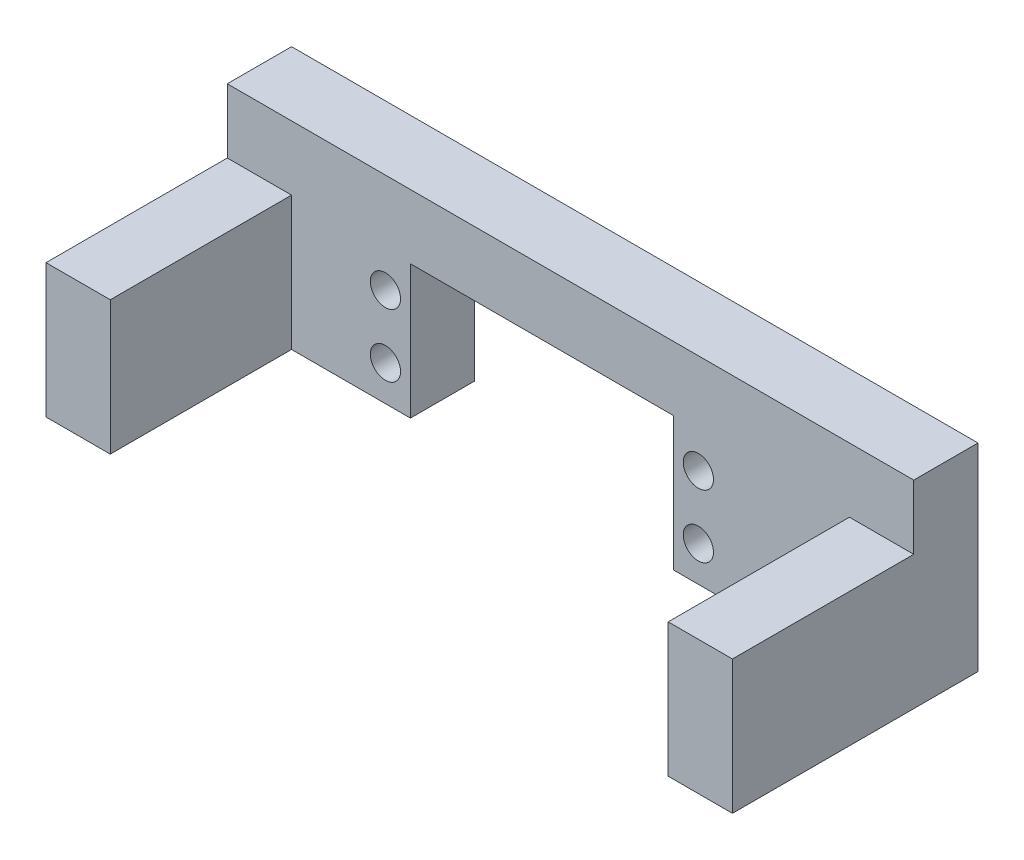
ISO-10303-21;
HEADER;
FILE_DESCRIPTION(('STEP AP214'),'2;1');
FILE_NAME('part.step','',(''),(''),'','','');
FILE_SCHEMA(('AUTOMOTIVE_DESIGN { 1 0 10303 214 1 1 1 1 }'));
ENDSEC;
DATA;
#1=APPLICATION_CONTEXT('core data for automotive mechanical design processes');
#2=APPLICATION_PROTOCOL_DEFINITION('international standard','automotive_design',2000,#1);
#3=PRODUCT_CONTEXT('',#1,'mechanical');
#4=PRODUCT('Part','Part','',(#3));
#5=PRODUCT_RELATED_PRODUCT_CATEGORY('part','',(#4));
#6=PRODUCT_DEFINITION_FORMATION('','',#4);
#7=PRODUCT_DEFINITION_CONTEXT('part definition',#1,'design');
#8=PRODUCT_DEFINITION('design','',#6,#7);
#9=PRODUCT_DEFINITION_SHAPE('','',#8);
#10=(LENGTH_UNIT() NAMED_UNIT(*) SI_UNIT(.MILLI.,.METRE.));
#11=(NAMED_UNIT(*) PLANE_ANGLE_UNIT() SI_UNIT($,.RADIAN.));
#12=(NAMED_UNIT(*) SI_UNIT($,.STERADIAN.) SOLID_ANGLE_UNIT());
#13=UNCERTAINTY_MEASURE_WITH_UNIT(LENGTH_MEASURE(1.E-05),#10,'distance_accuracy_value','');
#14=(GEOMETRIC_REPRESENTATION_CONTEXT(3) GLOBAL_UNCERTAINTY_ASSIGNED_CONTEXT((#13)) GLOBAL_UNIT_ASSIGNED_CONTEXT((#10,
#11,#12)) REPRESENTATION_CONTEXT('',''));
#15=CARTESIAN_POINT('',(0.,0.,0.));
#16=DIRECTION('',(0.,0.,1.));
#17=DIRECTION('',(1.,0.,0.));
#18=AXIS2_PLACEMENT_3D('',#15,#16,#17);
#19=CARTESIAN_POINT('',(0.,10.4,0.));
#20=DIRECTION('',(0.,1.,0.));
#21=DIRECTION('',(-1.,0.,0.));
#22=AXIS2_PLACEMENT_3D('',#19,#20,#21);
#23=PLANE('',#22);
#24=DIRECTION('',(0.,0.,-1.));
#25=VECTOR('',#24,1.);
#26=CARTESIAN_POINT('',(11.,10.4,10.));
#27=LINE('',#26,#25);
#28=CARTESIAN_POINT('',(11.,10.4,10.));
#29=VERTEX_POINT('',#28);
#30=CARTESIAN_POINT('',(11.,10.4,0.));
#31=VERTEX_POINT('',#30);
#32=EDGE_CURVE('E189',#29,#31,#27,.T.);
#33=ORIENTED_EDGE('',*,*,#32,.F.);
#34=DIRECTION('',(1.,0.,0.));
#35=VECTOR('',#34,1.);
#36=CARTESIAN_POINT('',(-58.395,10.4,10.));
#37=LINE('',#36,#35);
#38=CARTESIAN_POINT('',(-29.9,10.4,10.));
#39=VERTEX_POINT('',#38);
#40=EDGE_CURVE('E251',#39,#29,#37,.T.);
#41=ORIENTED_EDGE('',*,*,#40,.F.);
#42=DIRECTION('',(0.,0.,-1.));
#43=VECTOR('',#42,1.);
#44=CARTESIAN_POINT('',(-29.9,10.4,10.));
#45=LINE('',#44,#43);
#46=CARTESIAN_POINT('',(-29.9,10.4,0.));
#47=VERTEX_POINT('',#46);
#48=EDGE_CURVE('E313',#39,#47,#45,.T.);
#49=ORIENTED_EDGE('',*,*,#48,.T.);
#50=DIRECTION('',(-1.,0.,0.));
#51=VECTOR('',#50,1.);
#52=CARTESIAN_POINT('',(-58.395,10.4,0.));
#53=LINE('',#52,#51);
#54=EDGE_CURVE('E257',#31,#47,#53,.T.);
#55=ORIENTED_EDGE('',*,*,#54,.F.);
#56=EDGE_LOOP('',(#33,#41,#49,#55));
#57=FACE_BOUND('',#56,.T.);
#58=ADVANCED_FACE('F63',(#57),#23,.F.);
#59=CARTESIAN_POINT('',(-48.395,10.4,10.));
#60=DIRECTION('',(0.,1.,0.));
#61=DIRECTION('',(-1.,0.,0.));
#62=AXIS2_PLACEMENT_3D('',#59,#60,#61);
#63=PLANE('',#62);
#64=CARTESIAN_POINT('',(-58.395,10.4,10.));
#65=VERTEX_POINT('',#64);
#66=CARTESIAN_POINT('',(-48.395,10.4,10.));
#67=VERTEX_POINT('',#66);
#68=EDGE_CURVE('E268',#65,#67,#37,.T.);
#69=ORIENTED_EDGE('',*,*,#68,.F.);
#70=DIRECTION('',(0.,0.,-1.));
#71=VECTOR('',#70,1.);
#72=CARTESIAN_POINT('',(-58.395,10.4,10.));
#73=LINE('',#72,#71);
#74=CARTESIAN_POINT('',(-58.395,10.4,38.2));
#75=VERTEX_POINT('',#74);
#76=EDGE_CURVE('E107',#75,#65,#73,.T.);
#77=ORIENTED_EDGE('',*,*,#76,.F.);
#78=DIRECTION('',(-1.,0.,0.));
#79=VECTOR('',#78,1.);
#80=CARTESIAN_POINT('',(-58.395,10.4,38.2));
#81=LINE('',#80,#79);
#82=CARTESIAN_POINT('',(-48.395,10.4,38.2));
#83=VERTEX_POINT('',#82);
#84=EDGE_CURVE('E290',#83,#75,#81,.T.);
#85=ORIENTED_EDGE('',*,*,#84,.F.);
#86=DIRECTION('',(0.,0.,-1.));
#87=VECTOR('',#86,1.);
#88=CARTESIAN_POINT('',(-48.395,10.4,38.2));
#89=LINE('',#88,#87);
#90=EDGE_CURVE('E293',#83,#67,#89,.T.);
#91=ORIENTED_EDGE('',*,*,#90,.T.);
#92=EDGE_LOOP('',(#69,#77,#85,#91));
#93=FACE_BOUND('',#92,.T.);
#94=ADVANCED_FACE('F358',(#93),#63,.T.);
#95=CARTESIAN_POINT('',(-48.395,-10.4,10.));
#96=DIRECTION('',(0.,1.,0.));
#97=DIRECTION('',(0.,0.,1.));
#98=AXIS2_PLACEMENT_3D('',#95,#96,#97);
#99=PLANE('',#98);
#100=DIRECTION('',(-1.,0.,0.));
#101=VECTOR('',#100,1.);
#102=CARTESIAN_POINT('',(-48.395,-10.4,0.));
#103=LINE('',#102,#101);
#104=CARTESIAN_POINT('',(-29.9,-10.4,0.));
#105=VERTEX_POINT('',#104);
#106=CARTESIAN_POINT('',(-58.395,-10.4,0.));
#107=VERTEX_POINT('',#106);
#108=EDGE_CURVE('E12',#105,#107,#103,.T.);
#109=ORIENTED_EDGE('',*,*,#108,.F.);
#110=DIRECTION('',(0.,0.,-1.));
#111=VECTOR('',#110,1.);
#112=CARTESIAN_POINT('',(-29.9,-10.4,10.));
#113=LINE('',#112,#111);
#114=CARTESIAN_POINT('',(-29.9,-10.4,10.));
#115=VERTEX_POINT('',#114);
#116=EDGE_CURVE('E303',#115,#105,#113,.T.);
#117=ORIENTED_EDGE('',*,*,#116,.F.);
#118=DIRECTION('',(-1.,0.,0.));
#119=VECTOR('',#118,1.);
#120=CARTESIAN_POINT('',(-48.395,-10.4,10.));
#121=LINE('',#120,#119);
#122=CARTESIAN_POINT('',(-48.395,-10.4,10.));
#123=VERTEX_POINT('',#122);
#124=EDGE_CURVE('E99',#115,#123,#121,.T.);
#125=ORIENTED_EDGE('',*,*,#124,.T.);
#126=DIRECTION('',(0.,0.,-1.));
#127=VECTOR('',#126,1.);
#128=CARTESIAN_POINT('',(-48.395,-10.4,38.2));
#129=LINE('',#128,#127);
#130=CARTESIAN_POINT('',(-48.395,-10.4,38.2));
#131=VERTEX_POINT('',#130);
#132=EDGE_CURVE('E299',#131,#123,#129,.T.);
#133=ORIENTED_EDGE('',*,*,#132,.F.);
#134=DIRECTION('',(1.,0.,0.));
#135=VECTOR('',#134,1.);
#136=CARTESIAN_POINT('',(-58.395,-10.4,38.2));
#137=LINE('',#136,#135);
#138=CARTESIAN_POINT('',(-58.395,-10.4,38.2));
#139=VERTEX_POINT('',#138);
#140=EDGE_CURVE('E284',#139,#131,#137,.T.);
#141=ORIENTED_EDGE('',*,*,#140,.F.);
#142=DIRECTION('',(0.,0.,-1.));
#143=VECTOR('',#142,1.);
#144=CARTESIAN_POINT('',(-58.395,-10.4,10.));
#145=LINE('',#144,#143);
#146=EDGE_CURVE('E90',#139,#107,#145,.T.);
#147=ORIENTED_EDGE('',*,*,#146,.T.);
#148=EDGE_LOOP('',(#109,#117,#125,#133,#141,#147));
#149=FACE_BOUND('',#148,.T.);
#150=ADVANCED_FACE('F364',(#149),#99,.F.);
#151=CARTESIAN_POINT('',(-29.9,-10.4,10.));
#152=DIRECTION('',(-1.,0.,0.));
#153=DIRECTION('',(0.,0.,1.));
#154=AXIS2_PLACEMENT_3D('',#151,#152,#153);
#155=PLANE('',#154);
#156=DIRECTION('',(0.,1.,0.));
#157=VECTOR('',#156,1.);
#158=CARTESIAN_POINT('',(-29.9,-10.4,0.));
#159=LINE('',#158,#157);
#160=EDGE_CURVE('E308',#105,#47,#159,.T.);
#161=ORIENTED_EDGE('',*,*,#160,.T.);
#162=ORIENTED_EDGE('',*,*,#48,.F.);
#163=DIRECTION('',(0.,1.,0.));
#164=VECTOR('',#163,1.);
#165=CARTESIAN_POINT('',(-29.9,-10.4,10.));
#166=LINE('',#165,#164);
#167=EDGE_CURVE('E67',#115,#39,#166,.T.);
#168=ORIENTED_EDGE('',*,*,#167,.F.);
#169=ORIENTED_EDGE('',*,*,#116,.T.);
#170=EDGE_LOOP('',(#161,#162,#168,#169));
#171=FACE_BOUND('',#170,.T.);
#172=ADVANCED_FACE('F327',(#171),#155,.F.);
#173=CARTESIAN_POINT('',(0.,0.,10.));
#174=DIRECTION('',(0.,0.,1.));
#175=DIRECTION('',(1.,0.,0.));
#176=AXIS2_PLACEMENT_3D('',#173,#174,#175);
#177=PLANE('',#176);
#178=CARTESIAN_POINT('',(14.89,4.9,10.));
#179=DIRECTION('',(0.,0.,1.));
#180=DIRECTION('',(-1.,0.,0.));
#181=AXIS2_PLACEMENT_3D('',#178,#179,#180);
#182=CIRCLE('',#181,2.35);
#183=CARTESIAN_POINT('',(12.54,4.9,10.));
#184=VERTEX_POINT('',#183);
#185=EDGE_CURVE('E496',#184,#184,#182,.T.);
#186=ORIENTED_EDGE('',*,*,#185,.F.);
#187=EDGE_LOOP('',(#186));
#188=FACE_BOUND('',#187,.T.);
#189=CARTESIAN_POINT('',(-33.79,-4.9,10.));
#190=DIRECTION('',(0.,0.,1.));
#191=DIRECTION('',(-1.,0.,0.));
#192=AXIS2_PLACEMENT_3D('',#189,#190,#191);
#193=CIRCLE('',#192,2.35);
#194=CARTESIAN_POINT('',(-36.14,-4.9,10.));
#195=VERTEX_POINT('',#194);
#196=EDGE_CURVE('E504',#195,#195,#193,.T.);
#197=ORIENTED_EDGE('',*,*,#196,.F.);
#198=EDGE_LOOP('',(#197));
#199=FACE_BOUND('',#198,.T.);
#200=CARTESIAN_POINT('',(-33.79,4.9,10.));
#201=DIRECTION('',(0.,0.,1.));
#202=DIRECTION('',(1.,0.,0.));
#203=AXIS2_PLACEMENT_3D('',#200,#201,#202);
#204=CIRCLE('',#203,2.35);
#205=CARTESIAN_POINT('',(-31.44,4.9,10.));
#206=VERTEX_POINT('',#205);
#207=EDGE_CURVE('E524',#206,#206,#204,.T.);
#208=ORIENTED_EDGE('',*,*,#207,.F.);
#209=EDGE_LOOP('',(#208));
#210=FACE_BOUND('',#209,.T.);
#211=CARTESIAN_POINT('',(14.89,-4.9,10.));
#212=DIRECTION('',(0.,0.,1.));
#213=DIRECTION('',(1.,0.,0.));
#214=AXIS2_PLACEMENT_3D('',#211,#212,#213);
#215=CIRCLE('',#214,2.35);
#216=CARTESIAN_POINT('',(17.24,-4.9,10.));
#217=VERTEX_POINT('',#216);
#218=EDGE_CURVE('E213',#217,#217,#215,.T.);
#219=ORIENTED_EDGE('',*,*,#218,.F.);
#220=EDGE_LOOP('',(#219));
#221=FACE_BOUND('',#220,.T.);
#222=DIRECTION('',(0.,1.,0.));
#223=VECTOR('',#222,1.);
#224=CARTESIAN_POINT('',(-48.395,10.4,10.));
#225=LINE('',#224,#223);
#226=EDGE_CURVE('E81',#123,#67,#225,.T.);
#227=ORIENTED_EDGE('',*,*,#226,.F.);
#228=ORIENTED_EDGE('',*,*,#124,.F.);
#229=ORIENTED_EDGE('',*,*,#167,.T.);
#230=ORIENTED_EDGE('',*,*,#40,.T.);
#231=DIRECTION('',(0.,-1.,0.));
#232=VECTOR('',#231,1.);
#233=CARTESIAN_POINT('',(11.,10.4,10.));
#234=LINE('',#233,#232);
#235=CARTESIAN_POINT('',(11.,-10.4,10.));
#236=VERTEX_POINT('',#235);
#237=EDGE_CURVE('E230',#29,#236,#234,.T.);
#238=ORIENTED_EDGE('',*,*,#237,.T.);
#239=DIRECTION('',(-1.,0.,0.));
#240=VECTOR('',#239,1.);
#241=CARTESIAN_POINT('',(48.395,-10.4,10.));
#242=LINE('',#241,#240);
#243=CARTESIAN_POINT('',(38.395,-10.4,10.));
#244=VERTEX_POINT('',#243);
#245=EDGE_CURVE('E227',#244,#236,#242,.T.);
#246=ORIENTED_EDGE('',*,*,#245,.F.);
#247=DIRECTION('',(0.,-1.,0.));
#248=VECTOR('',#247,1.);
#249=CARTESIAN_POINT('',(38.395,10.4,10.));
#250=LINE('',#249,#248);
#251=CARTESIAN_POINT('',(38.395,10.4,10.));
#252=VERTEX_POINT('',#251);
#253=EDGE_CURVE('E206',#252,#244,#250,.T.);
#254=ORIENTED_EDGE('',*,*,#253,.F.);
#255=DIRECTION('',(1.,0.,0.));
#256=VECTOR('',#255,1.);
#257=CARTESIAN_POINT('',(0.,10.4,10.));
#258=LINE('',#257,#256);
#259=CARTESIAN_POINT('',(48.395,10.4,10.));
#260=VERTEX_POINT('',#259);
#261=EDGE_CURVE('E243',#252,#260,#258,.T.);
#262=ORIENTED_EDGE('',*,*,#261,.T.);
#263=DIRECTION('',(0.,-1.,0.));
#264=VECTOR('',#263,1.);
#265=CARTESIAN_POINT('',(48.395,20.4,10.));
#266=LINE('',#265,#264);
#267=CARTESIAN_POINT('',(48.395,20.4,10.));
#268=VERTEX_POINT('',#267);
#269=EDGE_CURVE('E184',#268,#260,#266,.T.);
#270=ORIENTED_EDGE('',*,*,#269,.F.);
#271=DIRECTION('',(1.,0.,0.));
#272=VECTOR('',#271,1.);
#273=CARTESIAN_POINT('',(-58.395,20.4,10.));
#274=LINE('',#273,#272);
#275=CARTESIAN_POINT('',(-58.395,20.4,10.));
#276=VERTEX_POINT('',#275);
#277=EDGE_CURVE('E256',#276,#268,#274,.T.);
#278=ORIENTED_EDGE('',*,*,#277,.F.);
#279=DIRECTION('',(0.,-1.,0.));
#280=VECTOR('',#279,1.);
#281=CARTESIAN_POINT('',(-58.395,20.4,10.));
#282=LINE('',#281,#280);
#283=EDGE_CURVE('E277',#276,#65,#282,.T.);
#284=ORIENTED_EDGE('',*,*,#283,.T.);
#285=ORIENTED_EDGE('',*,*,#68,.T.);
#286=EDGE_LOOP('',(#227,#228,#229,#230,#238,#246,#254,#262,#270,#278,#284,#285));
#287=FACE_BOUND('',#286,.T.);
#288=ADVANCED_FACE('F65',(#188,#199,#210,#221,#287),#177,.T.);
#289=CARTESIAN_POINT('',(0.,0.,0.));
#290=DIRECTION('',(0.,0.,1.));
#291=DIRECTION('',(1.,0.,0.));
#292=AXIS2_PLACEMENT_3D('',#289,#290,#291);
#293=PLANE('',#292);
#294=CARTESIAN_POINT('',(14.89,4.9,0.));
#295=DIRECTION('',(0.,0.,1.));
#296=DIRECTION('',(-1.,0.,0.));
#297=AXIS2_PLACEMENT_3D('',#294,#295,#296);
#298=CIRCLE('',#297,2.35);
#299=CARTESIAN_POINT('',(12.54,4.9,0.));
#300=VERTEX_POINT('',#299);
#301=EDGE_CURVE('E493',#300,#300,#298,.T.);
#302=ORIENTED_EDGE('',*,*,#301,.T.);
#303=EDGE_LOOP('',(#302));
#304=FACE_BOUND('',#303,.T.);
#305=CARTESIAN_POINT('',(-33.79,-4.9,0.));
#306=DIRECTION('',(0.,0.,1.));
#307=DIRECTION('',(-1.,0.,0.));
#308=AXIS2_PLACEMENT_3D('',#305,#306,#307);
#309=CIRCLE('',#308,2.35);
#310=CARTESIAN_POINT('',(-36.14,-4.9,0.));
#311=VERTEX_POINT('',#310);
#312=EDGE_CURVE('E498',#311,#311,#309,.T.);
#313=ORIENTED_EDGE('',*,*,#312,.T.);
#314=EDGE_LOOP('',(#313));
#315=FACE_BOUND('',#314,.T.);
#316=CARTESIAN_POINT('',(-33.79,4.9,0.));
#317=DIRECTION('',(0.,0.,1.));
#318=DIRECTION('',(1.,0.,0.));
#319=AXIS2_PLACEMENT_3D('',#316,#317,#318);
#320=CIRCLE('',#319,2.35);
#321=CARTESIAN_POINT('',(-31.44,4.9,0.));
#322=VERTEX_POINT('',#321);
#323=EDGE_CURVE('E510',#322,#322,#320,.T.);
#324=ORIENTED_EDGE('',*,*,#323,.T.);
#325=EDGE_LOOP('',(#324));
#326=FACE_BOUND('',#325,.T.);
#327=CARTESIAN_POINT('',(14.89,-4.9,0.));
#328=DIRECTION('',(0.,0.,1.));
#329=DIRECTION('',(1.,0.,0.));
#330=AXIS2_PLACEMENT_3D('',#327,#328,#329);
#331=CIRCLE('',#330,2.35);
#332=CARTESIAN_POINT('',(17.24,-4.9,0.));
#333=VERTEX_POINT('',#332);
#334=EDGE_CURVE('E210',#333,#333,#331,.T.);
#335=ORIENTED_EDGE('',*,*,#334,.T.);
#336=EDGE_LOOP('',(#335));
#337=FACE_BOUND('',#336,.T.);
#338=DIRECTION('',(0.,-1.,0.));
#339=VECTOR('',#338,1.);
#340=CARTESIAN_POINT('',(-58.395,10.4,0.));
#341=LINE('',#340,#339);
#342=CARTESIAN_POINT('',(-58.395,20.4,0.));
#343=VERTEX_POINT('',#342);
#344=EDGE_CURVE('E73',#343,#107,#341,.T.);
#345=ORIENTED_EDGE('',*,*,#344,.F.);
#346=DIRECTION('',(-1.,0.,0.));
#347=VECTOR('',#346,1.);
#348=CARTESIAN_POINT('',(-58.395,20.4,0.));
#349=LINE('',#348,#347);
#350=CARTESIAN_POINT('',(48.395,20.4,0.));
#351=VERTEX_POINT('',#350);
#352=EDGE_CURVE('E263',#351,#343,#349,.T.);
#353=ORIENTED_EDGE('',*,*,#352,.F.);
#354=DIRECTION('',(0.,-1.,0.));
#355=VECTOR('',#354,1.);
#356=CARTESIAN_POINT('',(48.395,20.4,0.));
#357=LINE('',#356,#355);
#358=CARTESIAN_POINT('',(48.395,-10.4,0.));
#359=VERTEX_POINT('',#358);
#360=EDGE_CURVE('E267',#351,#359,#357,.T.);
#361=ORIENTED_EDGE('',*,*,#360,.T.);
#362=DIRECTION('',(-1.,0.,0.));
#363=VECTOR('',#362,1.);
#364=CARTESIAN_POINT('',(48.395,-10.4,0.));
#365=LINE('',#364,#363);
#366=CARTESIAN_POINT('',(11.,-10.4,0.));
#367=VERTEX_POINT('',#366);
#368=EDGE_CURVE('E226',#359,#367,#365,.T.);
#369=ORIENTED_EDGE('',*,*,#368,.T.);
#370=DIRECTION('',(0.,-1.,0.));
#371=VECTOR('',#370,1.);
#372=CARTESIAN_POINT('',(11.,10.4,0.));
#373=LINE('',#372,#371);
#374=EDGE_CURVE('E231',#31,#367,#373,.T.);
#375=ORIENTED_EDGE('',*,*,#374,.F.);
#376=ORIENTED_EDGE('',*,*,#54,.T.);
#377=ORIENTED_EDGE('',*,*,#160,.F.);
#378=ORIENTED_EDGE('',*,*,#108,.T.);
#379=EDGE_LOOP('',(#345,#353,#361,#369,#375,#376,#377,#378));
#380=FACE_BOUND('',#379,.T.);
#381=ADVANCED_FACE('F337',(#304,#315,#326,#337,#380),#293,.F.);
#382=CARTESIAN_POINT('',(-58.395,10.4,10.));
#383=DIRECTION('',(1.,0.,0.));
#384=DIRECTION('',(0.,0.,-1.));
#385=AXIS2_PLACEMENT_3D('',#382,#383,#384);
#386=PLANE('',#385);
#387=ORIENTED_EDGE('',*,*,#344,.T.);
#388=ORIENTED_EDGE('',*,*,#146,.F.);
#389=DIRECTION('',(0.,-1.,0.));
#390=VECTOR('',#389,1.);
#391=CARTESIAN_POINT('',(-58.395,10.4,38.2));
#392=LINE('',#391,#390);
#393=EDGE_CURVE('E280',#75,#139,#392,.T.);
#394=ORIENTED_EDGE('',*,*,#393,.F.);
#395=ORIENTED_EDGE('',*,*,#76,.T.);
#396=ORIENTED_EDGE('',*,*,#283,.F.);
#397=DIRECTION('',(0.,0.,1.));
#398=VECTOR('',#397,1.);
#399=CARTESIAN_POINT('',(-58.395,20.4,0.));
#400=LINE('',#399,#398);
#401=EDGE_CURVE('E252',#343,#276,#400,.T.);
#402=ORIENTED_EDGE('',*,*,#401,.F.);
#403=EDGE_LOOP('',(#387,#388,#394,#395,#396,#402));
#404=FACE_BOUND('',#403,.T.);
#405=ADVANCED_FACE('F360',(#404),#386,.F.);
#406=CARTESIAN_POINT('',(-48.395,10.4,38.2));
#407=DIRECTION('',(-1.,0.,0.));
#408=DIRECTION('',(0.,0.,1.));
#409=AXIS2_PLACEMENT_3D('',#406,#407,#408);
#410=PLANE('',#409);
#411=ORIENTED_EDGE('',*,*,#226,.T.);
#412=ORIENTED_EDGE('',*,*,#90,.F.);
#413=DIRECTION('',(0.,1.,0.));
#414=VECTOR('',#413,1.);
#415=CARTESIAN_POINT('',(-48.395,10.4,38.2));
#416=LINE('',#415,#414);
#417=EDGE_CURVE('E287',#131,#83,#416,.T.);
#418=ORIENTED_EDGE('',*,*,#417,.F.);
#419=ORIENTED_EDGE('',*,*,#132,.T.);
#420=EDGE_LOOP('',(#411,#412,#418,#419));
#421=FACE_BOUND('',#420,.T.);
#422=ADVANCED_FACE('F369',(#421),#410,.F.);
#423=CARTESIAN_POINT('',(0.,0.,38.2));
#424=DIRECTION('',(0.,0.,1.));
#425=DIRECTION('',(1.,0.,0.));
#426=AXIS2_PLACEMENT_3D('',#423,#424,#425);
#427=PLANE('',#426);
#428=ORIENTED_EDGE('',*,*,#393,.T.);
#429=ORIENTED_EDGE('',*,*,#140,.T.);
#430=ORIENTED_EDGE('',*,*,#417,.T.);
#431=ORIENTED_EDGE('',*,*,#84,.T.);
#432=EDGE_LOOP('',(#428,#429,#430,#431));
#433=FACE_BOUND('',#432,.T.);
#434=ADVANCED_FACE('F376',(#433),#427,.T.);
#435=CARTESIAN_POINT('',(48.395,20.4,0.));
#436=DIRECTION('',(-1.,0.,0.));
#437=DIRECTION('',(0.,-1.,0.));
#438=AXIS2_PLACEMENT_3D('',#435,#436,#437);
#439=PLANE('',#438);
#440=ORIENTED_EDGE('',*,*,#269,.T.);
#441=DIRECTION('',(0.,0.,-1.));
#442=VECTOR('',#441,1.);
#443=CARTESIAN_POINT('',(48.395,10.4,10.));
#444=LINE('',#443,#442);
#445=CARTESIAN_POINT('',(48.395,10.4,38.2));
#446=VERTEX_POINT('',#445);
#447=EDGE_CURVE('E176',#446,#260,#444,.T.);
#448=ORIENTED_EDGE('',*,*,#447,.F.);
#449=DIRECTION('',(0.,1.,0.));
#450=VECTOR('',#449,1.);
#451=CARTESIAN_POINT('',(48.395,10.4,38.2));
#452=LINE('',#451,#450);
#453=CARTESIAN_POINT('',(48.395,-10.4,38.2));
#454=VERTEX_POINT('',#453);
#455=EDGE_CURVE('E181',#454,#446,#452,.T.);
#456=ORIENTED_EDGE('',*,*,#455,.F.);
#457=DIRECTION('',(0.,0.,-1.));
#458=VECTOR('',#457,1.);
#459=CARTESIAN_POINT('',(48.395,-10.4,10.));
#460=LINE('',#459,#458);
#461=EDGE_CURVE('E188',#454,#359,#460,.T.);
#462=ORIENTED_EDGE('',*,*,#461,.T.);
#463=ORIENTED_EDGE('',*,*,#360,.F.);
#464=DIRECTION('',(0.,0.,-1.));
#465=VECTOR('',#464,1.);
#466=CARTESIAN_POINT('',(48.395,20.4,0.));
#467=LINE('',#466,#465);
#468=EDGE_CURVE('E260',#268,#351,#467,.T.);
#469=ORIENTED_EDGE('',*,*,#468,.F.);
#470=EDGE_LOOP('',(#440,#448,#456,#462,#463,#469));
#471=FACE_BOUND('',#470,.T.);
#472=ADVANCED_FACE('F178',(#471),#439,.F.);
#473=CARTESIAN_POINT('',(0.,20.4,0.));
#474=DIRECTION('',(0.,1.,0.));
#475=DIRECTION('',(-1.,0.,0.));
#476=AXIS2_PLACEMENT_3D('',#473,#474,#475);
#477=PLANE('',#476);
#478=ORIENTED_EDGE('',*,*,#401,.T.);
#479=ORIENTED_EDGE('',*,*,#277,.T.);
#480=ORIENTED_EDGE('',*,*,#468,.T.);
#481=ORIENTED_EDGE('',*,*,#352,.T.);
#482=EDGE_LOOP('',(#478,#479,#480,#481));
#483=FACE_BOUND('',#482,.T.);
#484=ADVANCED_FACE('F389',(#483),#477,.T.);
#485=CARTESIAN_POINT('',(48.395,-10.4,10.));
#486=DIRECTION('',(0.,-1.,0.));
#487=DIRECTION('',(1.,0.,0.));
#488=AXIS2_PLACEMENT_3D('',#485,#486,#487);
#489=PLANE('',#488);
#490=ORIENTED_EDGE('',*,*,#368,.F.);
#491=ORIENTED_EDGE('',*,*,#461,.F.);
#492=DIRECTION('',(1.,0.,0.));
#493=VECTOR('',#492,1.);
#494=CARTESIAN_POINT('',(48.395,-10.4,38.2));
#495=LINE('',#494,#493);
#496=CARTESIAN_POINT('',(38.395,-10.4,38.2));
#497=VERTEX_POINT('',#496);
#498=EDGE_CURVE('E204',#497,#454,#495,.T.);
#499=ORIENTED_EDGE('',*,*,#498,.F.);
#500=DIRECTION('',(0.,0.,-1.));
#501=VECTOR('',#500,1.);
#502=CARTESIAN_POINT('',(38.395,-10.4,38.2));
#503=LINE('',#502,#501);
#504=EDGE_CURVE('E219',#497,#244,#503,.T.);
#505=ORIENTED_EDGE('',*,*,#504,.T.);
#506=ORIENTED_EDGE('',*,*,#245,.T.);
#507=DIRECTION('',(0.,0.,-1.));
#508=VECTOR('',#507,1.);
#509=CARTESIAN_POINT('',(11.,-10.4,10.));
#510=LINE('',#509,#508);
#511=EDGE_CURVE('E235',#236,#367,#510,.T.);
#512=ORIENTED_EDGE('',*,*,#511,.T.);
#513=EDGE_LOOP('',(#490,#491,#499,#505,#506,#512));
#514=FACE_BOUND('',#513,.T.);
#515=ADVANCED_FACE('F342',(#514),#489,.T.);
#516=CARTESIAN_POINT('',(48.395,10.4,10.));
#517=DIRECTION('',(0.,-1.,0.));
#518=DIRECTION('',(1.,0.,0.));
#519=AXIS2_PLACEMENT_3D('',#516,#517,#518);
#520=PLANE('',#519);
#521=ORIENTED_EDGE('',*,*,#261,.F.);
#522=DIRECTION('',(0.,0.,-1.));
#523=VECTOR('',#522,1.);
#524=CARTESIAN_POINT('',(38.395,10.4,38.2));
#525=LINE('',#524,#523);
#526=CARTESIAN_POINT('',(38.395,10.4,38.2));
#527=VERTEX_POINT('',#526);
#528=EDGE_CURVE('E195',#527,#252,#525,.T.);
#529=ORIENTED_EDGE('',*,*,#528,.F.);
#530=DIRECTION('',(-1.,0.,0.));
#531=VECTOR('',#530,1.);
#532=CARTESIAN_POINT('',(48.395,10.4,38.2));
#533=LINE('',#532,#531);
#534=EDGE_CURVE('E192',#446,#527,#533,.T.);
#535=ORIENTED_EDGE('',*,*,#534,.F.);
#536=ORIENTED_EDGE('',*,*,#447,.T.);
#537=EDGE_LOOP('',(#521,#529,#535,#536));
#538=FACE_BOUND('',#537,.T.);
#539=ADVANCED_FACE('F193',(#538),#520,.F.);
#540=CARTESIAN_POINT('',(11.,10.4,10.));
#541=DIRECTION('',(1.,0.,0.));
#542=DIRECTION('',(0.,0.,-1.));
#543=AXIS2_PLACEMENT_3D('',#540,#541,#542);
#544=PLANE('',#543);
#545=ORIENTED_EDGE('',*,*,#374,.T.);
#546=ORIENTED_EDGE('',*,*,#511,.F.);
#547=ORIENTED_EDGE('',*,*,#237,.F.);
#548=ORIENTED_EDGE('',*,*,#32,.T.);
#549=EDGE_LOOP('',(#545,#546,#547,#548));
#550=FACE_BOUND('',#549,.T.);
#551=ADVANCED_FACE('F334',(#550),#544,.F.);
#552=CARTESIAN_POINT('',(38.395,10.4,38.2));
#553=DIRECTION('',(1.,0.,0.));
#554=DIRECTION('',(0.,1.,0.));
#555=AXIS2_PLACEMENT_3D('',#552,#553,#554);
#556=PLANE('',#555);
#557=ORIENTED_EDGE('',*,*,#253,.T.);
#558=ORIENTED_EDGE('',*,*,#504,.F.);
#559=DIRECTION('',(0.,-1.,0.));
#560=VECTOR('',#559,1.);
#561=CARTESIAN_POINT('',(38.395,10.4,38.2));
#562=LINE('',#561,#560);
#563=EDGE_CURVE('E199',#527,#497,#562,.T.);
#564=ORIENTED_EDGE('',*,*,#563,.F.);
#565=ORIENTED_EDGE('',*,*,#528,.T.);
#566=EDGE_LOOP('',(#557,#558,#564,#565));
#567=FACE_BOUND('',#566,.T.);
#568=ADVANCED_FACE('F346',(#567),#556,.F.);
#569=CARTESIAN_POINT('',(0.,0.,38.2));
#570=DIRECTION('',(0.,0.,-1.));
#571=DIRECTION('',(-1.,0.,0.));
#572=AXIS2_PLACEMENT_3D('',#569,#570,#571);
#573=PLANE('',#572);
#574=ORIENTED_EDGE('',*,*,#455,.T.);
#575=ORIENTED_EDGE('',*,*,#534,.T.);
#576=ORIENTED_EDGE('',*,*,#563,.T.);
#577=ORIENTED_EDGE('',*,*,#498,.T.);
#578=EDGE_LOOP('',(#574,#575,#576,#577));
#579=FACE_BOUND('',#578,.T.);
#580=ADVANCED_FACE('F202',(#579),#573,.F.);
#581=CARTESIAN_POINT('',(14.89,-4.9,0.));
#582=DIRECTION('',(0.,0.,1.));
#583=DIRECTION('',(1.,0.,0.));
#584=AXIS2_PLACEMENT_3D('',#581,#582,#583);
#585=CYLINDRICAL_SURFACE('',#584,2.35);
#586=ORIENTED_EDGE('',*,*,#334,.F.);
#587=EDGE_LOOP('',(#586));
#588=FACE_BOUND('',#587,.T.);
#589=ORIENTED_EDGE('',*,*,#218,.T.);
#590=EDGE_LOOP('',(#589));
#591=FACE_BOUND('',#590,.T.);
#592=ADVANCED_FACE('F353',(#588,#591),#585,.F.);
#593=CARTESIAN_POINT('',(-33.79,4.9,0.));
#594=DIRECTION('',(0.,0.,1.));
#595=DIRECTION('',(1.,0.,0.));
#596=AXIS2_PLACEMENT_3D('',#593,#594,#595);
#597=CYLINDRICAL_SURFACE('',#596,2.35);
#598=ORIENTED_EDGE('',*,*,#323,.F.);
#599=EDGE_LOOP('',(#598));
#600=FACE_BOUND('',#599,.T.);
#601=ORIENTED_EDGE('',*,*,#207,.T.);
#602=EDGE_LOOP('',(#601));
#603=FACE_BOUND('',#602,.T.);
#604=ADVANCED_FACE('F455',(#600,#603),#597,.F.);
#605=CARTESIAN_POINT('',(-33.79,-4.9,0.));
#606=DIRECTION('',(0.,0.,1.));
#607=DIRECTION('',(1.,0.,0.));
#608=AXIS2_PLACEMENT_3D('',#605,#606,#607);
#609=CYLINDRICAL_SURFACE('',#608,2.35);
#610=ORIENTED_EDGE('',*,*,#312,.F.);
#611=EDGE_LOOP('',(#610));
#612=FACE_BOUND('',#611,.T.);
#613=ORIENTED_EDGE('',*,*,#196,.T.);
#614=EDGE_LOOP('',(#613));
#615=FACE_BOUND('',#614,.T.);
#616=ADVANCED_FACE('F466',(#612,#615),#609,.F.);
#617=CARTESIAN_POINT('',(14.89,4.9,0.));
#618=DIRECTION('',(0.,0.,1.));
#619=DIRECTION('',(1.,0.,0.));
#620=AXIS2_PLACEMENT_3D('',#617,#618,#619);
#621=CYLINDRICAL_SURFACE('',#620,2.35);
#622=ORIENTED_EDGE('',*,*,#301,.F.);
#623=EDGE_LOOP('',(#622));
#624=FACE_BOUND('',#623,.T.);
#625=ORIENTED_EDGE('',*,*,#185,.T.);
#626=EDGE_LOOP('',(#625));
#627=FACE_BOUND('',#626,.T.);
#628=ADVANCED_FACE('F476',(#624,#627),#621,.F.);
#629=CLOSED_SHELL('',(#58,#94,#150,#172,#288,#381,#405,#422,#434,#472,#484,#515,#539,#551,#568,
#580,#592,#604,#616,#628));
#630=MANIFOLD_SOLID_BREP('B2',#629);
#631=ADVANCED_BREP_SHAPE_REPRESENTATION('',(#18,#630),#14);
#632=SHAPE_DEFINITION_REPRESENTATION(#9,#631);
ENDSEC;
END-ISO-10303-21;
